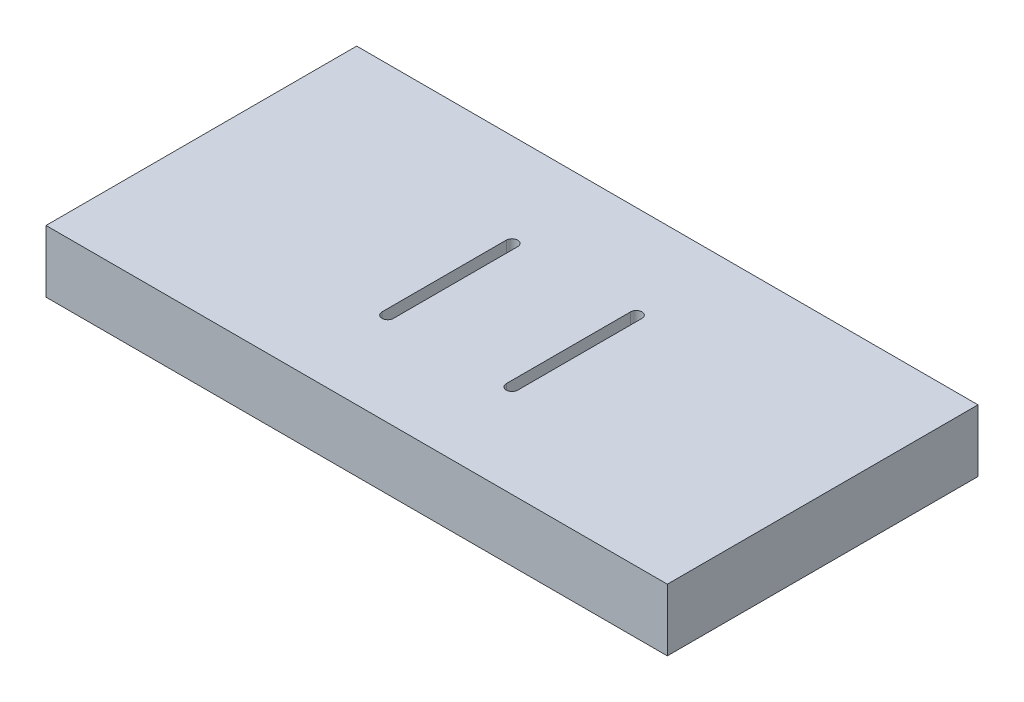
ISO-10303-21;
HEADER;
FILE_DESCRIPTION(('STEP AP214'),'2;1');
FILE_NAME('part.step','',(''),(''),'','','');
FILE_SCHEMA(('AUTOMOTIVE_DESIGN { 1 0 10303 214 1 1 1 1 }'));
ENDSEC;
DATA;
#1=APPLICATION_CONTEXT('core data for automotive mechanical design processes');
#2=APPLICATION_PROTOCOL_DEFINITION('international standard','automotive_design',2000,#1);
#3=PRODUCT_CONTEXT('',#1,'mechanical');
#4=PRODUCT('Part','Part','',(#3));
#5=PRODUCT_RELATED_PRODUCT_CATEGORY('part','',(#4));
#6=PRODUCT_DEFINITION_FORMATION('','',#4);
#7=PRODUCT_DEFINITION_CONTEXT('part definition',#1,'design');
#8=PRODUCT_DEFINITION('design','',#6,#7);
#9=PRODUCT_DEFINITION_SHAPE('','',#8);
#10=(LENGTH_UNIT() NAMED_UNIT(*) SI_UNIT(.MILLI.,.METRE.));
#11=(NAMED_UNIT(*) PLANE_ANGLE_UNIT() SI_UNIT($,.RADIAN.));
#12=(NAMED_UNIT(*) SI_UNIT($,.STERADIAN.) SOLID_ANGLE_UNIT());
#13=UNCERTAINTY_MEASURE_WITH_UNIT(LENGTH_MEASURE(1.E-05),#10,'distance_accuracy_value','');
#14=(GEOMETRIC_REPRESENTATION_CONTEXT(3) GLOBAL_UNCERTAINTY_ASSIGNED_CONTEXT((#13)) GLOBAL_UNIT_ASSIGNED_CONTEXT((#10,
#11,#12)) REPRESENTATION_CONTEXT('',''));
#15=CARTESIAN_POINT('',(0.,0.,0.));
#16=DIRECTION('',(0.,0.,1.));
#17=DIRECTION('',(1.,0.,0.));
#18=AXIS2_PLACEMENT_3D('',#15,#16,#17);
#19=CARTESIAN_POINT('',(-30.,0.,30.));
#20=DIRECTION('',(0.,1.,0.));
#21=DIRECTION('',(0.,0.,1.));
#22=AXIS2_PLACEMENT_3D('',#19,#20,#21);
#23=CYLINDRICAL_SURFACE('',#22,2.75);
#24=CARTESIAN_POINT('',(-30.,10.,30.));
#25=DIRECTION('',(0.,-1.,0.));
#26=DIRECTION('',(0.,0.,-1.));
#27=AXIS2_PLACEMENT_3D('',#24,#25,#26);
#28=CIRCLE('',#27,2.75);
#29=CARTESIAN_POINT('',(-32.75,10.,30.));
#30=VERTEX_POINT('',#29);
#31=CARTESIAN_POINT('',(-27.25,10.,30.));
#32=VERTEX_POINT('',#31);
#33=EDGE_CURVE('E66',#30,#32,#28,.F.);
#34=ORIENTED_EDGE('',*,*,#33,.F.);
#35=DIRECTION('',(0.,1.,0.));
#36=VECTOR('',#35,1.);
#37=CARTESIAN_POINT('',(-32.75,0.,30.));
#38=LINE('',#37,#36);
#39=CARTESIAN_POINT('',(-32.75,30.,30.));
#40=VERTEX_POINT('',#39);
#41=EDGE_CURVE('E308',#30,#40,#38,.T.);
#42=ORIENTED_EDGE('',*,*,#41,.T.);
#43=CARTESIAN_POINT('',(-30.,30.,30.));
#44=DIRECTION('',(0.,1.,0.));
#45=DIRECTION('',(0.,0.,1.));
#46=AXIS2_PLACEMENT_3D('',#43,#44,#45);
#47=CIRCLE('',#46,2.75);
#48=CARTESIAN_POINT('',(-27.25,30.,30.));
#49=VERTEX_POINT('',#48);
#50=EDGE_CURVE('E290',#40,#49,#47,.T.);
#51=ORIENTED_EDGE('',*,*,#50,.T.);
#52=DIRECTION('',(0.,1.,0.));
#53=VECTOR('',#52,1.);
#54=CARTESIAN_POINT('',(-27.25,0.,30.));
#55=LINE('',#54,#53);
#56=EDGE_CURVE('E307',#32,#49,#55,.T.);
#57=ORIENTED_EDGE('',*,*,#56,.F.);
#58=EDGE_LOOP('',(#34,#42,#51,#57));
#59=FACE_BOUND('',#58,.T.);
#60=ADVANCED_FACE('F43',(#59),#23,.F.);
#61=CARTESIAN_POINT('',(-32.75,0.,30.));
#62=DIRECTION('',(-1.,0.,0.));
#63=DIRECTION('',(0.,0.,1.));
#64=AXIS2_PLACEMENT_3D('',#61,#62,#63);
#65=PLANE('',#64);
#66=DIRECTION('',(0.,0.,1.));
#67=VECTOR('',#66,1.);
#68=CARTESIAN_POINT('',(-32.75,10.,30.));
#69=LINE('',#68,#67);
#70=CARTESIAN_POINT('',(-32.75,10.,-30.));
#71=VERTEX_POINT('',#70);
#72=EDGE_CURVE('E268',#71,#30,#69,.T.);
#73=ORIENTED_EDGE('',*,*,#72,.F.);
#74=DIRECTION('',(0.,1.,0.));
#75=VECTOR('',#74,1.);
#76=CARTESIAN_POINT('',(-32.75,0.,-30.));
#77=LINE('',#76,#75);
#78=CARTESIAN_POINT('',(-32.75,30.,-30.));
#79=VERTEX_POINT('',#78);
#80=EDGE_CURVE('E312',#71,#79,#77,.T.);
#81=ORIENTED_EDGE('',*,*,#80,.T.);
#82=DIRECTION('',(0.,0.,1.));
#83=VECTOR('',#82,1.);
#84=CARTESIAN_POINT('',(-32.75,30.,30.));
#85=LINE('',#84,#83);
#86=EDGE_CURVE('E303',#79,#40,#85,.T.);
#87=ORIENTED_EDGE('',*,*,#86,.T.);
#88=ORIENTED_EDGE('',*,*,#41,.F.);
#89=EDGE_LOOP('',(#73,#81,#87,#88));
#90=FACE_BOUND('',#89,.T.);
#91=ADVANCED_FACE('F411',(#90),#65,.F.);
#92=CARTESIAN_POINT('',(-30.,0.,-30.));
#93=DIRECTION('',(0.,1.,0.));
#94=DIRECTION('',(0.,0.,1.));
#95=AXIS2_PLACEMENT_3D('',#92,#93,#94);
#96=CYLINDRICAL_SURFACE('',#95,2.75);
#97=CARTESIAN_POINT('',(-30.,10.,-30.));
#98=DIRECTION('',(0.,-1.,0.));
#99=DIRECTION('',(0.,0.,-1.));
#100=AXIS2_PLACEMENT_3D('',#97,#98,#99);
#101=CIRCLE('',#100,2.75);
#102=CARTESIAN_POINT('',(-27.25,10.,-30.));
#103=VERTEX_POINT('',#102);
#104=EDGE_CURVE('E228',#103,#71,#101,.F.);
#105=ORIENTED_EDGE('',*,*,#104,.F.);
#106=DIRECTION('',(0.,1.,0.));
#107=VECTOR('',#106,1.);
#108=CARTESIAN_POINT('',(-27.25,0.,-30.));
#109=LINE('',#108,#107);
#110=CARTESIAN_POINT('',(-27.25,30.,-30.));
#111=VERTEX_POINT('',#110);
#112=EDGE_CURVE('E315',#103,#111,#109,.T.);
#113=ORIENTED_EDGE('',*,*,#112,.T.);
#114=CARTESIAN_POINT('',(-30.,30.,-30.));
#115=DIRECTION('',(0.,1.,0.));
#116=DIRECTION('',(0.,0.,1.));
#117=AXIS2_PLACEMENT_3D('',#114,#115,#116);
#118=CIRCLE('',#117,2.75);
#119=EDGE_CURVE('E299',#111,#79,#118,.T.);
#120=ORIENTED_EDGE('',*,*,#119,.T.);
#121=ORIENTED_EDGE('',*,*,#80,.F.);
#122=EDGE_LOOP('',(#105,#113,#120,#121));
#123=FACE_BOUND('',#122,.T.);
#124=ADVANCED_FACE('F400',(#123),#96,.F.);
#125=CARTESIAN_POINT('',(-27.25,0.,30.));
#126=DIRECTION('',(1.,0.,0.));
#127=DIRECTION('',(0.,0.,-1.));
#128=AXIS2_PLACEMENT_3D('',#125,#126,#127);
#129=PLANE('',#128);
#130=DIRECTION('',(0.,0.,-1.));
#131=VECTOR('',#130,1.);
#132=CARTESIAN_POINT('',(-27.25,10.,30.));
#133=LINE('',#132,#131);
#134=EDGE_CURVE('E52',#32,#103,#133,.T.);
#135=ORIENTED_EDGE('',*,*,#134,.F.);
#136=ORIENTED_EDGE('',*,*,#56,.T.);
#137=DIRECTION('',(0.,0.,-1.));
#138=VECTOR('',#137,1.);
#139=CARTESIAN_POINT('',(-27.25,30.,30.));
#140=LINE('',#139,#138);
#141=EDGE_CURVE('E294',#49,#111,#140,.T.);
#142=ORIENTED_EDGE('',*,*,#141,.T.);
#143=ORIENTED_EDGE('',*,*,#112,.F.);
#144=EDGE_LOOP('',(#135,#136,#142,#143));
#145=FACE_BOUND('',#144,.T.);
#146=ADVANCED_FACE('F401',(#145),#129,.F.);
#147=CARTESIAN_POINT('',(30.,0.,30.));
#148=DIRECTION('',(0.,-1.,0.));
#149=DIRECTION('',(0.,0.,-1.));
#150=AXIS2_PLACEMENT_3D('',#147,#148,#149);
#151=CYLINDRICAL_SURFACE('',#150,5.5);
#152=DIRECTION('',(0.,-1.,0.));
#153=VECTOR('',#152,1.);
#154=CARTESIAN_POINT('',(35.5,0.,30.));
#155=LINE('',#154,#153);
#156=CARTESIAN_POINT('',(35.5,0.,30.));
#157=VERTEX_POINT('',#156);
#158=CARTESIAN_POINT('',(35.5,10.,30.));
#159=VERTEX_POINT('',#158);
#160=EDGE_CURVE('E390',#157,#159,#155,.F.);
#161=ORIENTED_EDGE('',*,*,#160,.F.);
#162=CARTESIAN_POINT('',(30.,0.,30.));
#163=DIRECTION('',(0.,-1.,0.));
#164=DIRECTION('',(0.,0.,-1.));
#165=AXIS2_PLACEMENT_3D('',#162,#163,#164);
#166=CIRCLE('',#165,5.5);
#167=CARTESIAN_POINT('',(24.5,0.,30.));
#168=VERTEX_POINT('',#167);
#169=EDGE_CURVE('E285',#157,#168,#166,.T.);
#170=ORIENTED_EDGE('',*,*,#169,.T.);
#171=DIRECTION('',(0.,-1.,0.));
#172=VECTOR('',#171,1.);
#173=CARTESIAN_POINT('',(24.5,0.,30.));
#174=LINE('',#173,#172);
#175=CARTESIAN_POINT('',(24.5,10.,30.));
#176=VERTEX_POINT('',#175);
#177=EDGE_CURVE('E387',#168,#176,#174,.F.);
#178=ORIENTED_EDGE('',*,*,#177,.T.);
#179=CARTESIAN_POINT('',(30.,10.,30.));
#180=DIRECTION('',(0.,-1.,0.));
#181=DIRECTION('',(0.,0.,1.));
#182=AXIS2_PLACEMENT_3D('',#179,#180,#181);
#183=CIRCLE('',#182,5.50000000000001);
#184=EDGE_CURVE('E245',#159,#176,#183,.T.);
#185=ORIENTED_EDGE('',*,*,#184,.F.);
#186=EDGE_LOOP('',(#161,#170,#178,#185));
#187=FACE_BOUND('',#186,.T.);
#188=ADVANCED_FACE('F473',(#187),#151,.F.);
#189=CARTESIAN_POINT('',(-30.,0.,30.));
#190=DIRECTION('',(0.,-1.,0.));
#191=DIRECTION('',(0.,0.,-1.));
#192=AXIS2_PLACEMENT_3D('',#189,#190,#191);
#193=CYLINDRICAL_SURFACE('',#192,5.5);
#194=DIRECTION('',(0.,-1.,0.));
#195=VECTOR('',#194,1.);
#196=CARTESIAN_POINT('',(-24.5,10.,30.));
#197=LINE('',#196,#195);
#198=CARTESIAN_POINT('',(-24.5,10.,30.));
#199=VERTEX_POINT('',#198);
#200=CARTESIAN_POINT('',(-24.5,0.,30.));
#201=VERTEX_POINT('',#200);
#202=EDGE_CURVE('E225',#199,#201,#197,.T.);
#203=ORIENTED_EDGE('',*,*,#202,.T.);
#204=CARTESIAN_POINT('',(-30.,0.,30.));
#205=DIRECTION('',(0.,-1.,0.));
#206=DIRECTION('',(0.,0.,-1.));
#207=AXIS2_PLACEMENT_3D('',#204,#205,#206);
#208=CIRCLE('',#207,5.5);
#209=CARTESIAN_POINT('',(-35.5,0.,30.));
#210=VERTEX_POINT('',#209);
#211=EDGE_CURVE('E187',#201,#210,#208,.T.);
#212=ORIENTED_EDGE('',*,*,#211,.T.);
#213=DIRECTION('',(0.,-1.,0.));
#214=VECTOR('',#213,1.);
#215=CARTESIAN_POINT('',(-35.5,10.,30.));
#216=LINE('',#215,#214);
#217=CARTESIAN_POINT('',(-35.5,10.,30.));
#218=VERTEX_POINT('',#217);
#219=EDGE_CURVE('E180',#218,#210,#216,.T.);
#220=ORIENTED_EDGE('',*,*,#219,.F.);
#221=CARTESIAN_POINT('',(-30.,10.,30.));
#222=DIRECTION('',(0.,-1.,0.));
#223=DIRECTION('',(0.,0.,-1.));
#224=AXIS2_PLACEMENT_3D('',#221,#222,#223);
#225=CIRCLE('',#224,5.50000000000001);
#226=EDGE_CURVE('E184',#199,#218,#225,.T.);
#227=ORIENTED_EDGE('',*,*,#226,.F.);
#228=EDGE_LOOP('',(#203,#212,#220,#227));
#229=FACE_BOUND('',#228,.T.);
#230=ADVANCED_FACE('F182',(#229),#193,.F.);
#231=CARTESIAN_POINT('',(150.,30.,75.));
#232=DIRECTION('',(-1.,0.,0.));
#233=DIRECTION('',(0.,0.,1.));
#234=AXIS2_PLACEMENT_3D('',#231,#232,#233);
#235=PLANE('',#234);
#236=DIRECTION('',(0.,0.,-1.));
#237=VECTOR('',#236,1.);
#238=CARTESIAN_POINT('',(150.,0.,75.));
#239=LINE('',#238,#237);
#240=CARTESIAN_POINT('',(150.,0.,75.));
#241=VERTEX_POINT('',#240);
#242=CARTESIAN_POINT('',(150.,0.,-75.));
#243=VERTEX_POINT('',#242);
#244=EDGE_CURVE('E311',#241,#243,#239,.T.);
#245=ORIENTED_EDGE('',*,*,#244,.T.);
#246=DIRECTION('',(0.,-1.,0.));
#247=VECTOR('',#246,1.);
#248=CARTESIAN_POINT('',(150.,30.,-75.));
#249=LINE('',#248,#247);
#250=CARTESIAN_POINT('',(150.,30.,-75.));
#251=VERTEX_POINT('',#250);
#252=EDGE_CURVE('E383',#251,#243,#249,.T.);
#253=ORIENTED_EDGE('',*,*,#252,.F.);
#254=DIRECTION('',(0.,0.,-1.));
#255=VECTOR('',#254,1.);
#256=CARTESIAN_POINT('',(150.,30.,75.));
#257=LINE('',#256,#255);
#258=CARTESIAN_POINT('',(150.,30.,75.));
#259=VERTEX_POINT('',#258);
#260=EDGE_CURVE('E346',#259,#251,#257,.T.);
#261=ORIENTED_EDGE('',*,*,#260,.F.);
#262=DIRECTION('',(0.,-1.,0.));
#263=VECTOR('',#262,1.);
#264=CARTESIAN_POINT('',(150.,30.,75.));
#265=LINE('',#264,#263);
#266=EDGE_CURVE('E360',#259,#241,#265,.T.);
#267=ORIENTED_EDGE('',*,*,#266,.T.);
#268=EDGE_LOOP('',(#245,#253,#261,#267));
#269=FACE_BOUND('',#268,.T.);
#270=ADVANCED_FACE('F45',(#269),#235,.F.);
#271=CARTESIAN_POINT('',(-150.,30.,-75.));
#272=DIRECTION('',(0.,0.,1.));
#273=DIRECTION('',(1.,0.,0.));
#274=AXIS2_PLACEMENT_3D('',#271,#272,#273);
#275=PLANE('',#274);
#276=DIRECTION('',(-1.,0.,0.));
#277=VECTOR('',#276,1.);
#278=CARTESIAN_POINT('',(-150.,0.,-75.));
#279=LINE('',#278,#277);
#280=CARTESIAN_POINT('',(-150.,0.,-75.));
#281=VERTEX_POINT('',#280);
#282=EDGE_CURVE('E364',#243,#281,#279,.T.);
#283=ORIENTED_EDGE('',*,*,#282,.T.);
#284=DIRECTION('',(0.,-1.,0.));
#285=VECTOR('',#284,1.);
#286=CARTESIAN_POINT('',(-150.,30.,-75.));
#287=LINE('',#286,#285);
#288=CARTESIAN_POINT('',(-150.,30.,-75.));
#289=VERTEX_POINT('',#288);
#290=EDGE_CURVE('E379',#289,#281,#287,.T.);
#291=ORIENTED_EDGE('',*,*,#290,.F.);
#292=DIRECTION('',(-1.,0.,0.));
#293=VECTOR('',#292,1.);
#294=CARTESIAN_POINT('',(-150.,30.,-75.));
#295=LINE('',#294,#293);
#296=EDGE_CURVE('E350',#251,#289,#295,.T.);
#297=ORIENTED_EDGE('',*,*,#296,.F.);
#298=ORIENTED_EDGE('',*,*,#252,.T.);
#299=EDGE_LOOP('',(#283,#291,#297,#298));
#300=FACE_BOUND('',#299,.T.);
#301=ADVANCED_FACE('F450',(#300),#275,.F.);
#302=CARTESIAN_POINT('',(-150.,30.,75.));
#303=DIRECTION('',(1.,0.,0.));
#304=DIRECTION('',(0.,0.,-1.));
#305=AXIS2_PLACEMENT_3D('',#302,#303,#304);
#306=PLANE('',#305);
#307=DIRECTION('',(0.,0.,1.));
#308=VECTOR('',#307,1.);
#309=CARTESIAN_POINT('',(-150.,0.,75.));
#310=LINE('',#309,#308);
#311=CARTESIAN_POINT('',(-150.,0.,75.));
#312=VERTEX_POINT('',#311);
#313=EDGE_CURVE('E367',#281,#312,#310,.T.);
#314=ORIENTED_EDGE('',*,*,#313,.T.);
#315=DIRECTION('',(0.,-1.,0.));
#316=VECTOR('',#315,1.);
#317=CARTESIAN_POINT('',(-150.,30.,75.));
#318=LINE('',#317,#316);
#319=CARTESIAN_POINT('',(-150.,30.,75.));
#320=VERTEX_POINT('',#319);
#321=EDGE_CURVE('E375',#320,#312,#318,.T.);
#322=ORIENTED_EDGE('',*,*,#321,.F.);
#323=DIRECTION('',(0.,0.,1.));
#324=VECTOR('',#323,1.);
#325=CARTESIAN_POINT('',(-150.,30.,75.));
#326=LINE('',#325,#324);
#327=EDGE_CURVE('E354',#289,#320,#326,.T.);
#328=ORIENTED_EDGE('',*,*,#327,.F.);
#329=ORIENTED_EDGE('',*,*,#290,.T.);
#330=EDGE_LOOP('',(#314,#322,#328,#329));
#331=FACE_BOUND('',#330,.T.);
#332=ADVANCED_FACE('F447',(#331),#306,.F.);
#333=CARTESIAN_POINT('',(-150.,30.,75.));
#334=DIRECTION('',(0.,0.,-1.));
#335=DIRECTION('',(-1.,0.,0.));
#336=AXIS2_PLACEMENT_3D('',#333,#334,#335);
#337=PLANE('',#336);
#338=DIRECTION('',(1.,0.,0.));
#339=VECTOR('',#338,1.);
#340=CARTESIAN_POINT('',(-150.,0.,75.));
#341=LINE('',#340,#339);
#342=EDGE_CURVE('E351',#312,#241,#341,.T.);
#343=ORIENTED_EDGE('',*,*,#342,.T.);
#344=ORIENTED_EDGE('',*,*,#266,.F.);
#345=DIRECTION('',(1.,0.,0.));
#346=VECTOR('',#345,1.);
#347=CARTESIAN_POINT('',(-150.,30.,75.));
#348=LINE('',#347,#346);
#349=EDGE_CURVE('E357',#320,#259,#348,.T.);
#350=ORIENTED_EDGE('',*,*,#349,.F.);
#351=ORIENTED_EDGE('',*,*,#321,.T.);
#352=EDGE_LOOP('',(#343,#344,#350,#351));
#353=FACE_BOUND('',#352,.T.);
#354=ADVANCED_FACE('F441',(#353),#337,.F.);
#355=CARTESIAN_POINT('',(0.,30.,0.));
#356=DIRECTION('',(0.,-1.,0.));
#357=DIRECTION('',(0.,0.,-1.));
#358=AXIS2_PLACEMENT_3D('',#355,#356,#357);
#359=PLANE('',#358);
#360=ORIENTED_EDGE('',*,*,#141,.F.);
#361=ORIENTED_EDGE('',*,*,#50,.F.);
#362=ORIENTED_EDGE('',*,*,#86,.F.);
#363=ORIENTED_EDGE('',*,*,#119,.F.);
#364=EDGE_LOOP('',(#360,#361,#362,#363));
#365=FACE_BOUND('',#364,.T.);
#366=DIRECTION('',(0.,0.,-1.));
#367=VECTOR('',#366,1.);
#368=CARTESIAN_POINT('',(32.75,30.,30.));
#369=LINE('',#368,#367);
#370=CARTESIAN_POINT('',(32.75,30.,30.));
#371=VERTEX_POINT('',#370);
#372=CARTESIAN_POINT('',(32.75,30.,-30.));
#373=VERTEX_POINT('',#372);
#374=EDGE_CURVE('E339',#371,#373,#369,.T.);
#375=ORIENTED_EDGE('',*,*,#374,.F.);
#376=CARTESIAN_POINT('',(30.,30.,30.));
#377=DIRECTION('',(0.,1.,0.));
#378=DIRECTION('',(0.,0.,-1.));
#379=AXIS2_PLACEMENT_3D('',#376,#377,#378);
#380=CIRCLE('',#379,2.75);
#381=CARTESIAN_POINT('',(27.25,30.,30.));
#382=VERTEX_POINT('',#381);
#383=EDGE_CURVE('E295',#382,#371,#380,.T.);
#384=ORIENTED_EDGE('',*,*,#383,.F.);
#385=DIRECTION('',(0.,0.,1.));
#386=VECTOR('',#385,1.);
#387=CARTESIAN_POINT('',(27.25,30.,30.));
#388=LINE('',#387,#386);
#389=CARTESIAN_POINT('',(27.25,30.,-30.));
#390=VERTEX_POINT('',#389);
#391=EDGE_CURVE('E323',#390,#382,#388,.T.);
#392=ORIENTED_EDGE('',*,*,#391,.F.);
#393=CARTESIAN_POINT('',(30.,30.,-30.));
#394=DIRECTION('',(0.,1.,0.));
#395=DIRECTION('',(0.,0.,-1.));
#396=AXIS2_PLACEMENT_3D('',#393,#394,#395);
#397=CIRCLE('',#396,2.75);
#398=EDGE_CURVE('E335',#373,#390,#397,.T.);
#399=ORIENTED_EDGE('',*,*,#398,.F.);
#400=EDGE_LOOP('',(#375,#384,#392,#399));
#401=FACE_BOUND('',#400,.T.);
#402=ORIENTED_EDGE('',*,*,#260,.T.);
#403=ORIENTED_EDGE('',*,*,#296,.T.);
#404=ORIENTED_EDGE('',*,*,#327,.T.);
#405=ORIENTED_EDGE('',*,*,#349,.T.);
#406=EDGE_LOOP('',(#402,#403,#404,#405));
#407=FACE_BOUND('',#406,.T.);
#408=ADVANCED_FACE('F407',(#365,#401,#407),#359,.F.);
#409=CARTESIAN_POINT('',(0.,0.,0.));
#410=DIRECTION('',(0.,-1.,0.));
#411=DIRECTION('',(0.,0.,-1.));
#412=AXIS2_PLACEMENT_3D('',#409,#410,#411);
#413=PLANE('',#412);
#414=DIRECTION('',(0.,0.,1.));
#415=VECTOR('',#414,1.);
#416=CARTESIAN_POINT('',(-24.5,0.,30.));
#417=LINE('',#416,#415);
#418=CARTESIAN_POINT('',(-24.5,0.,-30.));
#419=VERTEX_POINT('',#418);
#420=EDGE_CURVE('E207',#419,#201,#417,.T.);
#421=ORIENTED_EDGE('',*,*,#420,.F.);
#422=CARTESIAN_POINT('',(-30.,0.,-30.));
#423=DIRECTION('',(0.,-1.,0.));
#424=DIRECTION('',(0.,0.,-1.));
#425=AXIS2_PLACEMENT_3D('',#422,#423,#424);
#426=CIRCLE('',#425,5.50000000000001);
#427=CARTESIAN_POINT('',(-35.5,0.,-30.));
#428=VERTEX_POINT('',#427);
#429=EDGE_CURVE('E211',#428,#419,#426,.T.);
#430=ORIENTED_EDGE('',*,*,#429,.F.);
#431=DIRECTION('',(0.,0.,-1.));
#432=VECTOR('',#431,1.);
#433=CARTESIAN_POINT('',(-35.5,0.,30.));
#434=LINE('',#433,#432);
#435=EDGE_CURVE('E218',#210,#428,#434,.T.);
#436=ORIENTED_EDGE('',*,*,#435,.F.);
#437=ORIENTED_EDGE('',*,*,#211,.F.);
#438=EDGE_LOOP('',(#421,#430,#436,#437));
#439=FACE_BOUND('',#438,.T.);
#440=DIRECTION('',(0.,0.,1.));
#441=VECTOR('',#440,1.);
#442=CARTESIAN_POINT('',(35.5,0.,30.));
#443=LINE('',#442,#441);
#444=CARTESIAN_POINT('',(35.5,0.,-30.));
#445=VERTEX_POINT('',#444);
#446=EDGE_CURVE('E241',#445,#157,#443,.T.);
#447=ORIENTED_EDGE('',*,*,#446,.F.);
#448=CARTESIAN_POINT('',(30.,0.,-30.));
#449=DIRECTION('',(0.,-1.,0.));
#450=DIRECTION('',(0.,0.,1.));
#451=AXIS2_PLACEMENT_3D('',#448,#449,#450);
#452=CIRCLE('',#451,5.50000000000001);
#453=CARTESIAN_POINT('',(24.5,0.,-30.));
#454=VERTEX_POINT('',#453);
#455=EDGE_CURVE('E244',#454,#445,#452,.T.);
#456=ORIENTED_EDGE('',*,*,#455,.F.);
#457=DIRECTION('',(0.,0.,-1.));
#458=VECTOR('',#457,1.);
#459=CARTESIAN_POINT('',(24.5,0.,30.));
#460=LINE('',#459,#458);
#461=EDGE_CURVE('E221',#168,#454,#460,.T.);
#462=ORIENTED_EDGE('',*,*,#461,.F.);
#463=ORIENTED_EDGE('',*,*,#169,.F.);
#464=EDGE_LOOP('',(#447,#456,#462,#463));
#465=FACE_BOUND('',#464,.T.);
#466=ORIENTED_EDGE('',*,*,#244,.F.);
#467=ORIENTED_EDGE('',*,*,#342,.F.);
#468=ORIENTED_EDGE('',*,*,#313,.F.);
#469=ORIENTED_EDGE('',*,*,#282,.F.);
#470=EDGE_LOOP('',(#466,#467,#468,#469));
#471=FACE_BOUND('',#470,.T.);
#472=ADVANCED_FACE('F426',(#439,#465,#471),#413,.T.);
#473=CARTESIAN_POINT('',(30.,0.,30.));
#474=DIRECTION('',(0.,1.,0.));
#475=DIRECTION('',(0.,0.,1.));
#476=AXIS2_PLACEMENT_3D('',#473,#474,#475);
#477=CYLINDRICAL_SURFACE('',#476,2.75);
#478=DIRECTION('',(0.,1.,0.));
#479=VECTOR('',#478,1.);
#480=CARTESIAN_POINT('',(32.75,0.,30.));
#481=LINE('',#480,#479);
#482=CARTESIAN_POINT('',(32.75,10.,30.));
#483=VERTEX_POINT('',#482);
#484=EDGE_CURVE('E320',#483,#371,#481,.T.);
#485=ORIENTED_EDGE('',*,*,#484,.F.);
#486=CARTESIAN_POINT('',(30.,10.,30.));
#487=DIRECTION('',(0.,1.,0.));
#488=DIRECTION('',(0.,0.,1.));
#489=AXIS2_PLACEMENT_3D('',#486,#487,#488);
#490=CIRCLE('',#489,2.75);
#491=CARTESIAN_POINT('',(27.25,10.,30.));
#492=VERTEX_POINT('',#491);
#493=EDGE_CURVE('E59',#483,#492,#490,.F.);
#494=ORIENTED_EDGE('',*,*,#493,.T.);
#495=DIRECTION('',(0.,1.,0.));
#496=VECTOR('',#495,1.);
#497=CARTESIAN_POINT('',(27.25,0.,30.));
#498=LINE('',#497,#496);
#499=EDGE_CURVE('E289',#492,#382,#498,.T.);
#500=ORIENTED_EDGE('',*,*,#499,.T.);
#501=ORIENTED_EDGE('',*,*,#383,.T.);
#502=EDGE_LOOP('',(#485,#494,#500,#501));
#503=FACE_BOUND('',#502,.T.);
#504=ADVANCED_FACE('F422',(#503),#477,.F.);
#505=CARTESIAN_POINT('',(27.25,0.,30.));
#506=DIRECTION('',(-1.,0.,0.));
#507=DIRECTION('',(0.,0.,1.));
#508=AXIS2_PLACEMENT_3D('',#505,#506,#507);
#509=PLANE('',#508);
#510=ORIENTED_EDGE('',*,*,#499,.F.);
#511=DIRECTION('',(0.,0.,-1.));
#512=VECTOR('',#511,1.);
#513=CARTESIAN_POINT('',(27.25,10.,30.));
#514=LINE('',#513,#512);
#515=CARTESIAN_POINT('',(27.25,10.,-30.));
#516=VERTEX_POINT('',#515);
#517=EDGE_CURVE('E277',#492,#516,#514,.T.);
#518=ORIENTED_EDGE('',*,*,#517,.T.);
#519=DIRECTION('',(0.,1.,0.));
#520=VECTOR('',#519,1.);
#521=CARTESIAN_POINT('',(27.25,0.,-30.));
#522=LINE('',#521,#520);
#523=EDGE_CURVE('E327',#516,#390,#522,.T.);
#524=ORIENTED_EDGE('',*,*,#523,.T.);
#525=ORIENTED_EDGE('',*,*,#391,.T.);
#526=EDGE_LOOP('',(#510,#518,#524,#525));
#527=FACE_BOUND('',#526,.T.);
#528=ADVANCED_FACE('F425',(#527),#509,.F.);
#529=CARTESIAN_POINT('',(30.,0.,-30.));
#530=DIRECTION('',(0.,1.,0.));
#531=DIRECTION('',(0.,0.,1.));
#532=AXIS2_PLACEMENT_3D('',#529,#530,#531);
#533=CYLINDRICAL_SURFACE('',#532,2.75);
#534=ORIENTED_EDGE('',*,*,#523,.F.);
#535=CARTESIAN_POINT('',(30.,10.,-30.));
#536=DIRECTION('',(0.,1.,0.));
#537=DIRECTION('',(0.,0.,1.));
#538=AXIS2_PLACEMENT_3D('',#535,#536,#537);
#539=CIRCLE('',#538,2.75);
#540=CARTESIAN_POINT('',(32.75,10.,-30.));
#541=VERTEX_POINT('',#540);
#542=EDGE_CURVE('E273',#516,#541,#539,.F.);
#543=ORIENTED_EDGE('',*,*,#542,.T.);
#544=DIRECTION('',(0.,1.,0.));
#545=VECTOR('',#544,1.);
#546=CARTESIAN_POINT('',(32.75,0.,-30.));
#547=LINE('',#546,#545);
#548=EDGE_CURVE('E324',#541,#373,#547,.T.);
#549=ORIENTED_EDGE('',*,*,#548,.T.);
#550=ORIENTED_EDGE('',*,*,#398,.T.);
#551=EDGE_LOOP('',(#534,#543,#549,#550));
#552=FACE_BOUND('',#551,.T.);
#553=ADVANCED_FACE('F431',(#552),#533,.F.);
#554=CARTESIAN_POINT('',(32.75,0.,30.));
#555=DIRECTION('',(1.,0.,0.));
#556=DIRECTION('',(0.,0.,-1.));
#557=AXIS2_PLACEMENT_3D('',#554,#555,#556);
#558=PLANE('',#557);
#559=ORIENTED_EDGE('',*,*,#548,.F.);
#560=DIRECTION('',(0.,0.,1.));
#561=VECTOR('',#560,1.);
#562=CARTESIAN_POINT('',(32.75,10.,30.));
#563=LINE('',#562,#561);
#564=EDGE_CURVE('E11',#541,#483,#563,.T.);
#565=ORIENTED_EDGE('',*,*,#564,.T.);
#566=ORIENTED_EDGE('',*,*,#484,.T.);
#567=ORIENTED_EDGE('',*,*,#374,.T.);
#568=EDGE_LOOP('',(#559,#565,#566,#567));
#569=FACE_BOUND('',#568,.T.);
#570=ADVANCED_FACE('F428',(#569),#558,.F.);
#571=CARTESIAN_POINT('',(-30.,10.,30.));
#572=DIRECTION('',(0.,-1.,0.));
#573=DIRECTION('',(0.,0.,-1.));
#574=AXIS2_PLACEMENT_3D('',#571,#572,#573);
#575=PLANE('',#574);
#576=ORIENTED_EDGE('',*,*,#226,.T.);
#577=DIRECTION('',(0.,0.,-1.));
#578=VECTOR('',#577,1.);
#579=CARTESIAN_POINT('',(-35.5,10.,30.));
#580=LINE('',#579,#578);
#581=CARTESIAN_POINT('',(-35.5,10.,-30.));
#582=VERTEX_POINT('',#581);
#583=EDGE_CURVE('E196',#218,#582,#580,.T.);
#584=ORIENTED_EDGE('',*,*,#583,.T.);
#585=CARTESIAN_POINT('',(-30.,10.,-30.));
#586=DIRECTION('',(0.,-1.,0.));
#587=DIRECTION('',(0.,0.,-1.));
#588=AXIS2_PLACEMENT_3D('',#585,#586,#587);
#589=CIRCLE('',#588,5.50000000000001);
#590=CARTESIAN_POINT('',(-24.5,10.,-30.));
#591=VERTEX_POINT('',#590);
#592=EDGE_CURVE('E202',#582,#591,#589,.T.);
#593=ORIENTED_EDGE('',*,*,#592,.T.);
#594=DIRECTION('',(0.,0.,1.));
#595=VECTOR('',#594,1.);
#596=CARTESIAN_POINT('',(-24.5,10.,30.));
#597=LINE('',#596,#595);
#598=EDGE_CURVE('E193',#591,#199,#597,.T.);
#599=ORIENTED_EDGE('',*,*,#598,.T.);
#600=EDGE_LOOP('',(#576,#584,#593,#599));
#601=FACE_BOUND('',#600,.T.);
#602=ORIENTED_EDGE('',*,*,#33,.T.);
#603=ORIENTED_EDGE('',*,*,#134,.T.);
#604=ORIENTED_EDGE('',*,*,#104,.T.);
#605=ORIENTED_EDGE('',*,*,#72,.T.);
#606=EDGE_LOOP('',(#602,#603,#604,#605));
#607=FACE_BOUND('',#606,.T.);
#608=ADVANCED_FACE('F204',(#601,#607),#575,.T.);
#609=CARTESIAN_POINT('',(-24.5,10.,30.));
#610=DIRECTION('',(1.,0.,0.));
#611=DIRECTION('',(0.,0.,-1.));
#612=AXIS2_PLACEMENT_3D('',#609,#610,#611);
#613=PLANE('',#612);
#614=ORIENTED_EDGE('',*,*,#420,.T.);
#615=ORIENTED_EDGE('',*,*,#202,.F.);
#616=ORIENTED_EDGE('',*,*,#598,.F.);
#617=DIRECTION('',(0.,-1.,0.));
#618=VECTOR('',#617,1.);
#619=CARTESIAN_POINT('',(-24.5,10.,-30.));
#620=LINE('',#619,#618);
#621=EDGE_CURVE('E229',#591,#419,#620,.T.);
#622=ORIENTED_EDGE('',*,*,#621,.T.);
#623=EDGE_LOOP('',(#614,#615,#616,#622));
#624=FACE_BOUND('',#623,.T.);
#625=ADVANCED_FACE('F546',(#624),#613,.F.);
#626=CARTESIAN_POINT('',(-30.,10.,-30.));
#627=DIRECTION('',(0.,-1.,0.));
#628=DIRECTION('',(0.,0.,-1.));
#629=AXIS2_PLACEMENT_3D('',#626,#627,#628);
#630=CYLINDRICAL_SURFACE('',#629,5.50000000000001);
#631=ORIENTED_EDGE('',*,*,#429,.T.);
#632=ORIENTED_EDGE('',*,*,#621,.F.);
#633=ORIENTED_EDGE('',*,*,#592,.F.);
#634=DIRECTION('',(0.,-1.,0.));
#635=VECTOR('',#634,1.);
#636=CARTESIAN_POINT('',(-35.5,10.,-30.));
#637=LINE('',#636,#635);
#638=EDGE_CURVE('E192',#582,#428,#637,.T.);
#639=ORIENTED_EDGE('',*,*,#638,.T.);
#640=EDGE_LOOP('',(#631,#632,#633,#639));
#641=FACE_BOUND('',#640,.T.);
#642=ADVANCED_FACE('F556',(#641),#630,.F.);
#643=CARTESIAN_POINT('',(-35.5,10.,30.));
#644=DIRECTION('',(-1.,0.,0.));
#645=DIRECTION('',(0.,0.,1.));
#646=AXIS2_PLACEMENT_3D('',#643,#644,#645);
#647=PLANE('',#646);
#648=ORIENTED_EDGE('',*,*,#435,.T.);
#649=ORIENTED_EDGE('',*,*,#638,.F.);
#650=ORIENTED_EDGE('',*,*,#583,.F.);
#651=ORIENTED_EDGE('',*,*,#219,.T.);
#652=EDGE_LOOP('',(#648,#649,#650,#651));
#653=FACE_BOUND('',#652,.T.);
#654=ADVANCED_FACE('F197',(#653),#647,.F.);
#655=CARTESIAN_POINT('',(30.,10.,30.));
#656=DIRECTION('',(0.,1.,0.));
#657=DIRECTION('',(0.,0.,1.));
#658=AXIS2_PLACEMENT_3D('',#655,#656,#657);
#659=PLANE('',#658);
#660=ORIENTED_EDGE('',*,*,#184,.T.);
#661=DIRECTION('',(0.,0.,-1.));
#662=VECTOR('',#661,1.);
#663=CARTESIAN_POINT('',(24.5,10.,30.));
#664=LINE('',#663,#662);
#665=CARTESIAN_POINT('',(24.5,10.,-30.));
#666=VERTEX_POINT('',#665);
#667=EDGE_CURVE('E259',#176,#666,#664,.T.);
#668=ORIENTED_EDGE('',*,*,#667,.T.);
#669=CARTESIAN_POINT('',(30.,10.,-30.));
#670=DIRECTION('',(0.,-1.,0.));
#671=DIRECTION('',(0.,0.,1.));
#672=AXIS2_PLACEMENT_3D('',#669,#670,#671);
#673=CIRCLE('',#672,5.50000000000001);
#674=CARTESIAN_POINT('',(35.5,10.,-30.));
#675=VERTEX_POINT('',#674);
#676=EDGE_CURVE('E255',#666,#675,#673,.T.);
#677=ORIENTED_EDGE('',*,*,#676,.T.);
#678=DIRECTION('',(0.,0.,1.));
#679=VECTOR('',#678,1.);
#680=CARTESIAN_POINT('',(35.5,10.,30.));
#681=LINE('',#680,#679);
#682=EDGE_CURVE('E237',#675,#159,#681,.T.);
#683=ORIENTED_EDGE('',*,*,#682,.T.);
#684=EDGE_LOOP('',(#660,#668,#677,#683));
#685=FACE_BOUND('',#684,.T.);
#686=ORIENTED_EDGE('',*,*,#564,.F.);
#687=ORIENTED_EDGE('',*,*,#542,.F.);
#688=ORIENTED_EDGE('',*,*,#517,.F.);
#689=ORIENTED_EDGE('',*,*,#493,.F.);
#690=EDGE_LOOP('',(#686,#687,#688,#689));
#691=FACE_BOUND('',#690,.T.);
#692=ADVANCED_FACE('F481',(#685,#691),#659,.F.);
#693=CARTESIAN_POINT('',(35.5,10.,30.));
#694=DIRECTION('',(1.,0.,0.));
#695=DIRECTION('',(0.,0.,-1.));
#696=AXIS2_PLACEMENT_3D('',#693,#694,#695);
#697=PLANE('',#696);
#698=ORIENTED_EDGE('',*,*,#446,.T.);
#699=ORIENTED_EDGE('',*,*,#160,.T.);
#700=ORIENTED_EDGE('',*,*,#682,.F.);
#701=DIRECTION('',(0.,-1.,0.));
#702=VECTOR('',#701,1.);
#703=CARTESIAN_POINT('',(35.5,10.,-30.));
#704=LINE('',#703,#702);
#705=EDGE_CURVE('E238',#675,#445,#704,.T.);
#706=ORIENTED_EDGE('',*,*,#705,.T.);
#707=EDGE_LOOP('',(#698,#699,#700,#706));
#708=FACE_BOUND('',#707,.T.);
#709=ADVANCED_FACE('F586',(#708),#697,.F.);
#710=CARTESIAN_POINT('',(30.,10.,-30.));
#711=DIRECTION('',(0.,-1.,0.));
#712=DIRECTION('',(0.,0.,-1.));
#713=AXIS2_PLACEMENT_3D('',#710,#711,#712);
#714=CYLINDRICAL_SURFACE('',#713,5.50000000000001);
#715=ORIENTED_EDGE('',*,*,#455,.T.);
#716=ORIENTED_EDGE('',*,*,#705,.F.);
#717=ORIENTED_EDGE('',*,*,#676,.F.);
#718=DIRECTION('',(0.,-1.,0.));
#719=VECTOR('',#718,1.);
#720=CARTESIAN_POINT('',(24.5,10.,-30.));
#721=LINE('',#720,#719);
#722=EDGE_CURVE('E234',#666,#454,#721,.T.);
#723=ORIENTED_EDGE('',*,*,#722,.T.);
#724=EDGE_LOOP('',(#715,#716,#717,#723));
#725=FACE_BOUND('',#724,.T.);
#726=ADVANCED_FACE('F596',(#725),#714,.F.);
#727=CARTESIAN_POINT('',(24.5,10.,30.));
#728=DIRECTION('',(-1.,0.,0.));
#729=DIRECTION('',(0.,0.,1.));
#730=AXIS2_PLACEMENT_3D('',#727,#728,#729);
#731=PLANE('',#730);
#732=ORIENTED_EDGE('',*,*,#461,.T.);
#733=ORIENTED_EDGE('',*,*,#722,.F.);
#734=ORIENTED_EDGE('',*,*,#667,.F.);
#735=ORIENTED_EDGE('',*,*,#177,.F.);
#736=EDGE_LOOP('',(#732,#733,#734,#735));
#737=FACE_BOUND('',#736,.T.);
#738=ADVANCED_FACE('F606',(#737),#731,.F.);
#739=CLOSED_SHELL('',(#60,#91,#124,#146,#188,#230,#270,#301,#332,#354,#408,#472,#504,#528,#553,
#570,#608,#625,#642,#654,#692,#709,#726,#738));
#740=MANIFOLD_SOLID_BREP('B2',#739);
#741=ADVANCED_BREP_SHAPE_REPRESENTATION('',(#18,#740),#14);
#742=SHAPE_DEFINITION_REPRESENTATION(#9,#741);
ENDSEC;
END-ISO-10303-21;
